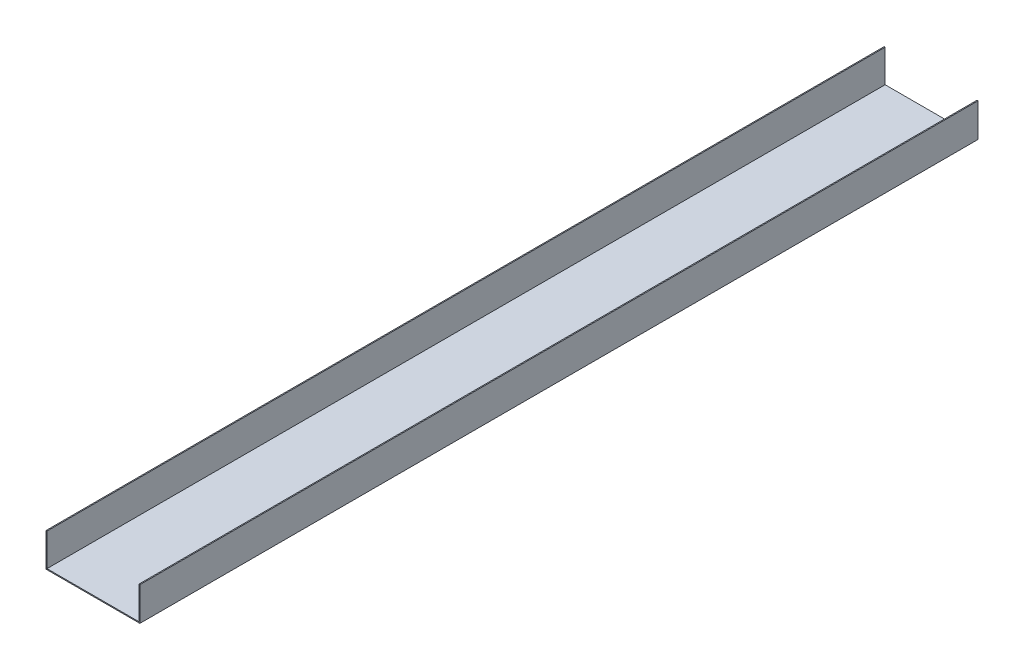
ISO-10303-21;
HEADER;
FILE_DESCRIPTION(('STEP AP214'),'2;1');
FILE_NAME('part.step','',(''),(''),'','','');
FILE_SCHEMA(('AUTOMOTIVE_DESIGN { 1 0 10303 214 1 1 1 1 }'));
ENDSEC;
DATA;
#1=APPLICATION_CONTEXT('core data for automotive mechanical design processes');
#2=APPLICATION_PROTOCOL_DEFINITION('international standard','automotive_design',2000,#1);
#3=PRODUCT_CONTEXT('',#1,'mechanical');
#4=PRODUCT('Part','Part','',(#3));
#5=PRODUCT_RELATED_PRODUCT_CATEGORY('part','',(#4));
#6=PRODUCT_DEFINITION_FORMATION('','',#4);
#7=PRODUCT_DEFINITION_CONTEXT('part definition',#1,'design');
#8=PRODUCT_DEFINITION('design','',#6,#7);
#9=PRODUCT_DEFINITION_SHAPE('','',#8);
#10=(LENGTH_UNIT() NAMED_UNIT(*) SI_UNIT(.MILLI.,.METRE.));
#11=(NAMED_UNIT(*) PLANE_ANGLE_UNIT() SI_UNIT($,.RADIAN.));
#12=(NAMED_UNIT(*) SI_UNIT($,.STERADIAN.) SOLID_ANGLE_UNIT());
#13=UNCERTAINTY_MEASURE_WITH_UNIT(LENGTH_MEASURE(1.E-05),#10,'distance_accuracy_value','');
#14=(GEOMETRIC_REPRESENTATION_CONTEXT(3) GLOBAL_UNCERTAINTY_ASSIGNED_CONTEXT((#13)) GLOBAL_UNIT_ASSIGNED_CONTEXT((#10,
#11,#12)) REPRESENTATION_CONTEXT('',''));
#15=CARTESIAN_POINT('',(0.,0.,0.));
#16=DIRECTION('',(0.,0.,1.));
#17=DIRECTION('',(1.,0.,0.));
#18=AXIS2_PLACEMENT_3D('',#15,#16,#17);
#19=CARTESIAN_POINT('',(-70.,48.5,1250.));
#20=DIRECTION('',(1.,0.,0.));
#21=DIRECTION('',(0.,0.,-1.));
#22=AXIS2_PLACEMENT_3D('',#19,#20,#21);
#23=PLANE('',#22);
#24=DIRECTION('',(0.,-1.,0.));
#25=VECTOR('',#24,1.);
#26=CARTESIAN_POINT('',(-70.,48.5,0.));
#27=LINE('',#26,#25);
#28=CARTESIAN_POINT('',(-70.,48.5,0.));
#29=VERTEX_POINT('',#28);
#30=CARTESIAN_POINT('',(-70.,-1.49999999999999,0.));
#31=VERTEX_POINT('',#30);
#32=EDGE_CURVE('E133',#29,#31,#27,.T.);
#33=ORIENTED_EDGE('',*,*,#32,.T.);
#34=DIRECTION('',(0.,0.,-1.));
#35=VECTOR('',#34,1.);
#36=CARTESIAN_POINT('',(-70.,-1.49999999999999,1250.));
#37=LINE('',#36,#35);
#38=CARTESIAN_POINT('',(-70.,-1.49999999999999,1250.));
#39=VERTEX_POINT('',#38);
#40=EDGE_CURVE('E11',#39,#31,#37,.T.);
#41=ORIENTED_EDGE('',*,*,#40,.F.);
#42=DIRECTION('',(0.,-1.,0.));
#43=VECTOR('',#42,1.);
#44=CARTESIAN_POINT('',(-70.,48.5,1250.));
#45=LINE('',#44,#43);
#46=CARTESIAN_POINT('',(-70.,48.5,1250.));
#47=VERTEX_POINT('',#46);
#48=EDGE_CURVE('E147',#47,#39,#45,.T.);
#49=ORIENTED_EDGE('',*,*,#48,.F.);
#50=DIRECTION('',(0.,0.,-1.));
#51=VECTOR('',#50,1.);
#52=CARTESIAN_POINT('',(-70.,48.5,1250.));
#53=LINE('',#52,#51);
#54=EDGE_CURVE('E129',#47,#29,#53,.T.);
#55=ORIENTED_EDGE('',*,*,#54,.T.);
#56=EDGE_LOOP('',(#33,#41,#49,#55));
#57=FACE_BOUND('',#56,.T.);
#58=ADVANCED_FACE('F37',(#57),#23,.F.);
#59=CARTESIAN_POINT('',(-70.,-1.49999999999999,1250.));
#60=DIRECTION('',(0.,1.,0.));
#61=DIRECTION('',(0.,0.,1.));
#62=AXIS2_PLACEMENT_3D('',#59,#60,#61);
#63=PLANE('',#62);
#64=DIRECTION('',(1.,0.,0.));
#65=VECTOR('',#64,1.);
#66=CARTESIAN_POINT('',(-70.,-1.49999999999999,0.));
#67=LINE('',#66,#65);
#68=CARTESIAN_POINT('',(70.,-1.49999999999999,0.));
#69=VERTEX_POINT('',#68);
#70=EDGE_CURVE('E136',#31,#69,#67,.T.);
#71=ORIENTED_EDGE('',*,*,#70,.T.);
#72=DIRECTION('',(0.,0.,-1.));
#73=VECTOR('',#72,1.);
#74=CARTESIAN_POINT('',(70.,-1.49999999999999,1250.));
#75=LINE('',#74,#73);
#76=CARTESIAN_POINT('',(70.,-1.49999999999999,1250.));
#77=VERTEX_POINT('',#76);
#78=EDGE_CURVE('E45',#77,#69,#75,.T.);
#79=ORIENTED_EDGE('',*,*,#78,.F.);
#80=DIRECTION('',(1.,0.,0.));
#81=VECTOR('',#80,1.);
#82=CARTESIAN_POINT('',(-70.,-1.49999999999999,1250.));
#83=LINE('',#82,#81);
#84=EDGE_CURVE('E96',#39,#77,#83,.T.);
#85=ORIENTED_EDGE('',*,*,#84,.F.);
#86=ORIENTED_EDGE('',*,*,#40,.T.);
#87=EDGE_LOOP('',(#71,#79,#85,#86));
#88=FACE_BOUND('',#87,.T.);
#89=ADVANCED_FACE('F182',(#88),#63,.F.);
#90=CARTESIAN_POINT('',(70.,-1.49999999999999,1250.));
#91=DIRECTION('',(-1.,0.,0.));
#92=DIRECTION('',(0.,0.,1.));
#93=AXIS2_PLACEMENT_3D('',#90,#91,#92);
#94=PLANE('',#93);
#95=DIRECTION('',(0.,1.,0.));
#96=VECTOR('',#95,1.);
#97=CARTESIAN_POINT('',(70.,-1.49999999999999,0.));
#98=LINE('',#97,#96);
#99=CARTESIAN_POINT('',(70.,48.5,0.));
#100=VERTEX_POINT('',#99);
#101=EDGE_CURVE('E138',#69,#100,#98,.T.);
#102=ORIENTED_EDGE('',*,*,#101,.T.);
#103=DIRECTION('',(0.,0.,-1.));
#104=VECTOR('',#103,1.);
#105=CARTESIAN_POINT('',(70.,48.5,1250.));
#106=LINE('',#105,#104);
#107=CARTESIAN_POINT('',(70.,48.5,1250.));
#108=VERTEX_POINT('',#107);
#109=EDGE_CURVE('E154',#108,#100,#106,.T.);
#110=ORIENTED_EDGE('',*,*,#109,.F.);
#111=DIRECTION('',(0.,1.,0.));
#112=VECTOR('',#111,1.);
#113=CARTESIAN_POINT('',(70.,-1.49999999999999,1250.));
#114=LINE('',#113,#112);
#115=EDGE_CURVE('E162',#77,#108,#114,.T.);
#116=ORIENTED_EDGE('',*,*,#115,.F.);
#117=ORIENTED_EDGE('',*,*,#78,.T.);
#118=EDGE_LOOP('',(#102,#110,#116,#117));
#119=FACE_BOUND('',#118,.T.);
#120=ADVANCED_FACE('F160',(#119),#94,.F.);
#121=CARTESIAN_POINT('',(70.,48.5,1250.));
#122=DIRECTION('',(0.,-1.,0.));
#123=DIRECTION('',(0.,0.,-1.));
#124=AXIS2_PLACEMENT_3D('',#121,#122,#123);
#125=PLANE('',#124);
#126=DIRECTION('',(-1.,0.,0.));
#127=VECTOR('',#126,1.);
#128=CARTESIAN_POINT('',(70.,48.5,0.));
#129=LINE('',#128,#127);
#130=CARTESIAN_POINT('',(68.5,48.5,0.));
#131=VERTEX_POINT('',#130);
#132=EDGE_CURVE('E140',#100,#131,#129,.T.);
#133=ORIENTED_EDGE('',*,*,#132,.T.);
#134=DIRECTION('',(0.,0.,-1.));
#135=VECTOR('',#134,1.);
#136=CARTESIAN_POINT('',(68.5,48.5,1250.));
#137=LINE('',#136,#135);
#138=CARTESIAN_POINT('',(68.5,48.5,1250.));
#139=VERTEX_POINT('',#138);
#140=EDGE_CURVE('E151',#139,#131,#137,.T.);
#141=ORIENTED_EDGE('',*,*,#140,.F.);
#142=DIRECTION('',(-1.,0.,0.));
#143=VECTOR('',#142,1.);
#144=CARTESIAN_POINT('',(70.,48.5,1250.));
#145=LINE('',#144,#143);
#146=EDGE_CURVE('E174',#108,#139,#145,.T.);
#147=ORIENTED_EDGE('',*,*,#146,.F.);
#148=ORIENTED_EDGE('',*,*,#109,.T.);
#149=EDGE_LOOP('',(#133,#141,#147,#148));
#150=FACE_BOUND('',#149,.T.);
#151=ADVANCED_FACE('F170',(#150),#125,.F.);
#152=CARTESIAN_POINT('',(68.5,48.5,1250.));
#153=DIRECTION('',(1.,0.,0.));
#154=DIRECTION('',(0.,0.,-1.));
#155=AXIS2_PLACEMENT_3D('',#152,#153,#154);
#156=PLANE('',#155);
#157=DIRECTION('',(0.,-1.,0.));
#158=VECTOR('',#157,1.);
#159=CARTESIAN_POINT('',(68.5,48.5,0.));
#160=LINE('',#159,#158);
#161=CARTESIAN_POINT('',(68.5,0.,0.));
#162=VERTEX_POINT('',#161);
#163=EDGE_CURVE('E142',#131,#162,#160,.T.);
#164=ORIENTED_EDGE('',*,*,#163,.T.);
#165=DIRECTION('',(0.,0.,-1.));
#166=VECTOR('',#165,1.);
#167=CARTESIAN_POINT('',(68.5,0.,1250.));
#168=LINE('',#167,#166);
#169=CARTESIAN_POINT('',(68.5,0.,1250.));
#170=VERTEX_POINT('',#169);
#171=EDGE_CURVE('E124',#170,#162,#168,.T.);
#172=ORIENTED_EDGE('',*,*,#171,.F.);
#173=DIRECTION('',(0.,-1.,0.));
#174=VECTOR('',#173,1.);
#175=CARTESIAN_POINT('',(68.5,48.5,1250.));
#176=LINE('',#175,#174);
#177=EDGE_CURVE('E115',#139,#170,#176,.T.);
#178=ORIENTED_EDGE('',*,*,#177,.F.);
#179=ORIENTED_EDGE('',*,*,#140,.T.);
#180=EDGE_LOOP('',(#164,#172,#178,#179));
#181=FACE_BOUND('',#180,.T.);
#182=ADVANCED_FACE('F173',(#181),#156,.F.);
#183=CARTESIAN_POINT('',(68.5,0.,1250.));
#184=DIRECTION('',(0.,-1.,0.));
#185=DIRECTION('',(0.,0.,-1.));
#186=AXIS2_PLACEMENT_3D('',#183,#184,#185);
#187=PLANE('',#186);
#188=DIRECTION('',(-1.,0.,0.));
#189=VECTOR('',#188,1.);
#190=CARTESIAN_POINT('',(68.5,0.,0.));
#191=LINE('',#190,#189);
#192=CARTESIAN_POINT('',(-68.5,0.,0.));
#193=VERTEX_POINT('',#192);
#194=EDGE_CURVE('E123',#162,#193,#191,.T.);
#195=ORIENTED_EDGE('',*,*,#194,.T.);
#196=DIRECTION('',(0.,0.,-1.));
#197=VECTOR('',#196,1.);
#198=CARTESIAN_POINT('',(-68.5,0.,1250.));
#199=LINE('',#198,#197);
#200=CARTESIAN_POINT('',(-68.5,0.,1250.));
#201=VERTEX_POINT('',#200);
#202=EDGE_CURVE('E120',#201,#193,#199,.T.);
#203=ORIENTED_EDGE('',*,*,#202,.F.);
#204=DIRECTION('',(-1.,0.,0.));
#205=VECTOR('',#204,1.);
#206=CARTESIAN_POINT('',(68.5,0.,1250.));
#207=LINE('',#206,#205);
#208=EDGE_CURVE('E109',#170,#201,#207,.T.);
#209=ORIENTED_EDGE('',*,*,#208,.F.);
#210=ORIENTED_EDGE('',*,*,#171,.T.);
#211=EDGE_LOOP('',(#195,#203,#209,#210));
#212=FACE_BOUND('',#211,.T.);
#213=ADVANCED_FACE('F121',(#212),#187,.F.);
#214=CARTESIAN_POINT('',(-68.5,0.,1250.));
#215=DIRECTION('',(-1.,0.,0.));
#216=DIRECTION('',(0.,0.,1.));
#217=AXIS2_PLACEMENT_3D('',#214,#215,#216);
#218=PLANE('',#217);
#219=DIRECTION('',(0.,1.,0.));
#220=VECTOR('',#219,1.);
#221=CARTESIAN_POINT('',(-68.5,0.,0.));
#222=LINE('',#221,#220);
#223=CARTESIAN_POINT('',(-68.5,48.5,0.));
#224=VERTEX_POINT('',#223);
#225=EDGE_CURVE('E82',#193,#224,#222,.T.);
#226=ORIENTED_EDGE('',*,*,#225,.T.);
#227=DIRECTION('',(0.,0.,-1.));
#228=VECTOR('',#227,1.);
#229=CARTESIAN_POINT('',(-68.5,48.5,1250.));
#230=LINE('',#229,#228);
#231=CARTESIAN_POINT('',(-68.5,48.5,1250.));
#232=VERTEX_POINT('',#231);
#233=EDGE_CURVE('E125',#232,#224,#230,.T.);
#234=ORIENTED_EDGE('',*,*,#233,.F.);
#235=DIRECTION('',(0.,1.,0.));
#236=VECTOR('',#235,1.);
#237=CARTESIAN_POINT('',(-68.5,0.,1250.));
#238=LINE('',#237,#236);
#239=EDGE_CURVE('E113',#201,#232,#238,.T.);
#240=ORIENTED_EDGE('',*,*,#239,.F.);
#241=ORIENTED_EDGE('',*,*,#202,.T.);
#242=EDGE_LOOP('',(#226,#234,#240,#241));
#243=FACE_BOUND('',#242,.T.);
#244=ADVANCED_FACE('F127',(#243),#218,.F.);
#245=CARTESIAN_POINT('',(-68.5,48.5,1250.));
#246=DIRECTION('',(0.,-1.,0.));
#247=DIRECTION('',(0.,0.,-1.));
#248=AXIS2_PLACEMENT_3D('',#245,#246,#247);
#249=PLANE('',#248);
#250=DIRECTION('',(-1.,0.,0.));
#251=VECTOR('',#250,1.);
#252=CARTESIAN_POINT('',(-68.5,48.5,0.));
#253=LINE('',#252,#251);
#254=EDGE_CURVE('E88',#224,#29,#253,.T.);
#255=ORIENTED_EDGE('',*,*,#254,.T.);
#256=ORIENTED_EDGE('',*,*,#54,.F.);
#257=DIRECTION('',(-1.,0.,0.));
#258=VECTOR('',#257,1.);
#259=CARTESIAN_POINT('',(-68.5,48.5,1250.));
#260=LINE('',#259,#258);
#261=EDGE_CURVE('E53',#232,#47,#260,.T.);
#262=ORIENTED_EDGE('',*,*,#261,.F.);
#263=ORIENTED_EDGE('',*,*,#233,.T.);
#264=EDGE_LOOP('',(#255,#256,#262,#263));
#265=FACE_BOUND('',#264,.T.);
#266=ADVANCED_FACE('F198',(#265),#249,.F.);
#267=CARTESIAN_POINT('',(0.,0.,1250.));
#268=DIRECTION('',(0.,0.,1.));
#269=DIRECTION('',(1.,0.,0.));
#270=AXIS2_PLACEMENT_3D('',#267,#268,#269);
#271=PLANE('',#270);
#272=ORIENTED_EDGE('',*,*,#48,.T.);
#273=ORIENTED_EDGE('',*,*,#84,.T.);
#274=ORIENTED_EDGE('',*,*,#115,.T.);
#275=ORIENTED_EDGE('',*,*,#146,.T.);
#276=ORIENTED_EDGE('',*,*,#177,.T.);
#277=ORIENTED_EDGE('',*,*,#208,.T.);
#278=ORIENTED_EDGE('',*,*,#239,.T.);
#279=ORIENTED_EDGE('',*,*,#261,.T.);
#280=EDGE_LOOP('',(#272,#273,#274,#275,#276,#277,#278,#279));
#281=FACE_BOUND('',#280,.T.);
#282=ADVANCED_FACE('F111',(#281),#271,.T.);
#283=CARTESIAN_POINT('',(0.,0.,0.));
#284=DIRECTION('',(0.,0.,1.));
#285=DIRECTION('',(1.,0.,0.));
#286=AXIS2_PLACEMENT_3D('',#283,#284,#285);
#287=PLANE('',#286);
#288=ORIENTED_EDGE('',*,*,#32,.F.);
#289=ORIENTED_EDGE('',*,*,#254,.F.);
#290=ORIENTED_EDGE('',*,*,#225,.F.);
#291=ORIENTED_EDGE('',*,*,#194,.F.);
#292=ORIENTED_EDGE('',*,*,#163,.F.);
#293=ORIENTED_EDGE('',*,*,#132,.F.);
#294=ORIENTED_EDGE('',*,*,#101,.F.);
#295=ORIENTED_EDGE('',*,*,#70,.F.);
#296=EDGE_LOOP('',(#288,#289,#290,#291,#292,#293,#294,#295));
#297=FACE_BOUND('',#296,.T.);
#298=ADVANCED_FACE('F166',(#297),#287,.F.);
#299=CLOSED_SHELL('',(#58,#89,#120,#151,#182,#213,#244,#266,#282,#298));
#300=MANIFOLD_SOLID_BREP('B2',#299);
#301=ADVANCED_BREP_SHAPE_REPRESENTATION('',(#18,#300),#14);
#302=SHAPE_DEFINITION_REPRESENTATION(#9,#301);
ENDSEC;
END-ISO-10303-21;
